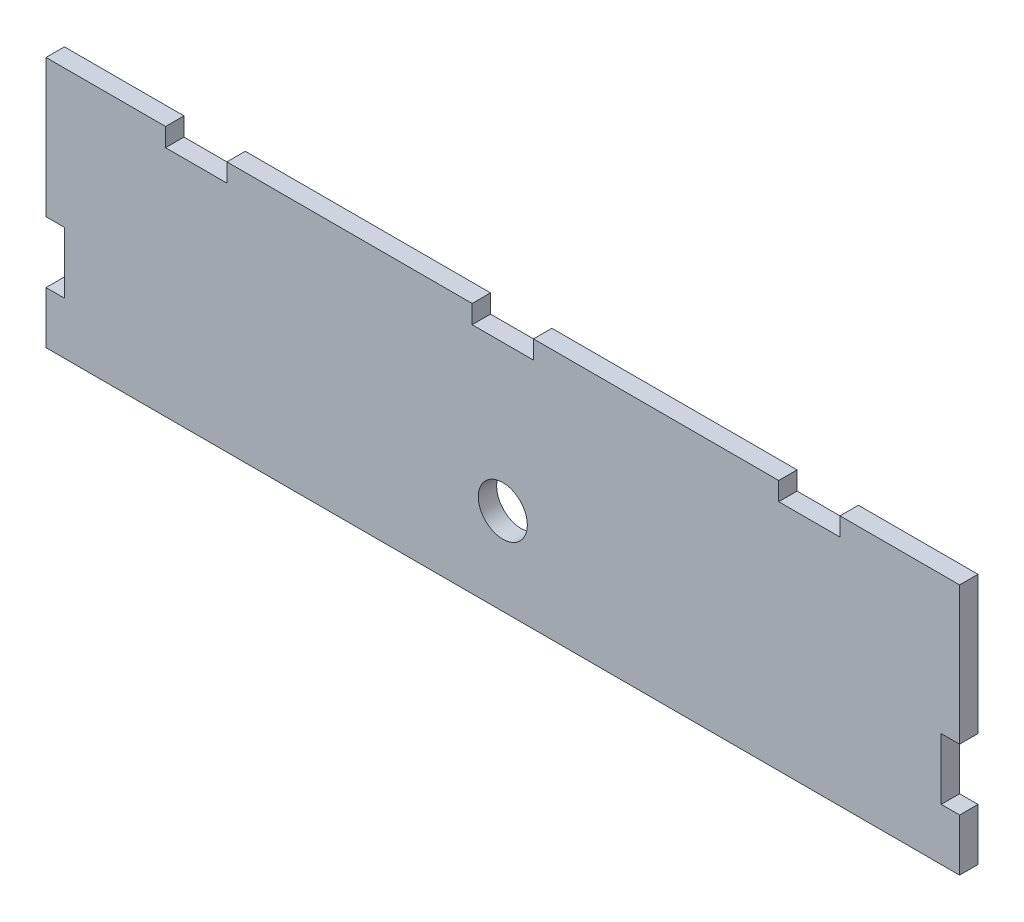
ISO-10303-21;
HEADER;
FILE_DESCRIPTION(('STEP AP214'),'2;1');
FILE_NAME('part.step','',(''),(''),'','','');
FILE_SCHEMA(('AUTOMOTIVE_DESIGN { 1 0 10303 214 1 1 1 1 }'));
ENDSEC;
DATA;
#1=APPLICATION_CONTEXT('core data for automotive mechanical design processes');
#2=APPLICATION_PROTOCOL_DEFINITION('international standard','automotive_design',2000,#1);
#3=PRODUCT_CONTEXT('',#1,'mechanical');
#4=PRODUCT('Part','Part','',(#3));
#5=PRODUCT_RELATED_PRODUCT_CATEGORY('part','',(#4));
#6=PRODUCT_DEFINITION_FORMATION('','',#4);
#7=PRODUCT_DEFINITION_CONTEXT('part definition',#1,'design');
#8=PRODUCT_DEFINITION('design','',#6,#7);
#9=PRODUCT_DEFINITION_SHAPE('','',#8);
#10=(LENGTH_UNIT() NAMED_UNIT(*) SI_UNIT(.MILLI.,.METRE.));
#11=(NAMED_UNIT(*) PLANE_ANGLE_UNIT() SI_UNIT($,.RADIAN.));
#12=(NAMED_UNIT(*) SI_UNIT($,.STERADIAN.) SOLID_ANGLE_UNIT());
#13=UNCERTAINTY_MEASURE_WITH_UNIT(LENGTH_MEASURE(1.E-05),#10,'distance_accuracy_value','');
#14=(GEOMETRIC_REPRESENTATION_CONTEXT(3) GLOBAL_UNCERTAINTY_ASSIGNED_CONTEXT((#13)) GLOBAL_UNIT_ASSIGNED_CONTEXT((#10,
#11,#12)) REPRESENTATION_CONTEXT('',''));
#15=CARTESIAN_POINT('',(0.,0.,0.));
#16=DIRECTION('',(0.,0.,1.));
#17=DIRECTION('',(1.,0.,0.));
#18=AXIS2_PLACEMENT_3D('',#15,#16,#17);
#19=CARTESIAN_POINT('',(74.5,-18.5,3.));
#20=DIRECTION('',(-1.,0.,0.));
#21=DIRECTION('',(0.,-1.,0.));
#22=AXIS2_PLACEMENT_3D('',#19,#20,#21);
#23=PLANE('',#22);
#24=DIRECTION('',(0.,1.,0.));
#25=VECTOR('',#24,1.);
#26=CARTESIAN_POINT('',(74.5,-18.5,0.));
#27=LINE('',#26,#25);
#28=CARTESIAN_POINT('',(74.5,-27.,0.));
#29=VERTEX_POINT('',#28);
#30=CARTESIAN_POINT('',(74.5,-18.5,0.));
#31=VERTEX_POINT('',#30);
#32=EDGE_CURVE('E225',#29,#31,#27,.T.);
#33=ORIENTED_EDGE('',*,*,#32,.T.);
#34=DIRECTION('',(0.,0.,-1.));
#35=VECTOR('',#34,1.);
#36=CARTESIAN_POINT('',(74.5,-18.5,3.));
#37=LINE('',#36,#35);
#38=CARTESIAN_POINT('',(74.5,-18.5,3.));
#39=VERTEX_POINT('',#38);
#40=EDGE_CURVE('E11',#39,#31,#37,.T.);
#41=ORIENTED_EDGE('',*,*,#40,.F.);
#42=DIRECTION('',(0.,1.,0.));
#43=VECTOR('',#42,1.);
#44=CARTESIAN_POINT('',(74.5,-18.5,3.));
#45=LINE('',#44,#43);
#46=CARTESIAN_POINT('',(74.5,-27.,3.));
#47=VERTEX_POINT('',#46);
#48=EDGE_CURVE('E272',#47,#39,#45,.T.);
#49=ORIENTED_EDGE('',*,*,#48,.F.);
#50=DIRECTION('',(0.,0.,-1.));
#51=VECTOR('',#50,1.);
#52=CARTESIAN_POINT('',(74.5,-27.,3.));
#53=LINE('',#52,#51);
#54=EDGE_CURVE('E221',#47,#29,#53,.T.);
#55=ORIENTED_EDGE('',*,*,#54,.T.);
#56=EDGE_LOOP('',(#33,#41,#49,#55));
#57=FACE_BOUND('',#56,.T.);
#58=ADVANCED_FACE('F33',(#57),#23,.F.);
#59=CARTESIAN_POINT('',(71.5,-18.5,3.));
#60=DIRECTION('',(0.,-1.,0.));
#61=DIRECTION('',(0.,0.,-1.));
#62=AXIS2_PLACEMENT_3D('',#59,#60,#61);
#63=PLANE('',#62);
#64=DIRECTION('',(-1.,0.,0.));
#65=VECTOR('',#64,1.);
#66=CARTESIAN_POINT('',(71.5,-18.5,0.));
#67=LINE('',#66,#65);
#68=CARTESIAN_POINT('',(71.5,-18.5,0.));
#69=VERTEX_POINT('',#68);
#70=EDGE_CURVE('E228',#31,#69,#67,.T.);
#71=ORIENTED_EDGE('',*,*,#70,.T.);
#72=DIRECTION('',(0.,0.,-1.));
#73=VECTOR('',#72,1.);
#74=CARTESIAN_POINT('',(71.5,-18.5,3.));
#75=LINE('',#74,#73);
#76=CARTESIAN_POINT('',(71.5,-18.5,3.));
#77=VERTEX_POINT('',#76);
#78=EDGE_CURVE('E41',#77,#69,#75,.T.);
#79=ORIENTED_EDGE('',*,*,#78,.F.);
#80=DIRECTION('',(-1.,0.,0.));
#81=VECTOR('',#80,1.);
#82=CARTESIAN_POINT('',(71.5,-18.5,3.));
#83=LINE('',#82,#81);
#84=EDGE_CURVE('E140',#39,#77,#83,.T.);
#85=ORIENTED_EDGE('',*,*,#84,.F.);
#86=ORIENTED_EDGE('',*,*,#40,.T.);
#87=EDGE_LOOP('',(#71,#79,#85,#86));
#88=FACE_BOUND('',#87,.T.);
#89=ADVANCED_FACE('F412',(#88),#63,.F.);
#90=CARTESIAN_POINT('',(71.5,-8.50000000000001,3.));
#91=DIRECTION('',(-1.,0.,0.));
#92=DIRECTION('',(0.,0.,1.));
#93=AXIS2_PLACEMENT_3D('',#90,#91,#92);
#94=PLANE('',#93);
#95=DIRECTION('',(0.,1.,0.));
#96=VECTOR('',#95,1.);
#97=CARTESIAN_POINT('',(71.5,-8.50000000000001,0.));
#98=LINE('',#97,#96);
#99=CARTESIAN_POINT('',(71.5,-8.50000000000001,0.));
#100=VERTEX_POINT('',#99);
#101=EDGE_CURVE('E231',#69,#100,#98,.T.);
#102=ORIENTED_EDGE('',*,*,#101,.T.);
#103=DIRECTION('',(0.,0.,-1.));
#104=VECTOR('',#103,1.);
#105=CARTESIAN_POINT('',(71.5,-8.50000000000001,3.));
#106=LINE('',#105,#104);
#107=CARTESIAN_POINT('',(71.5,-8.50000000000001,3.));
#108=VERTEX_POINT('',#107);
#109=EDGE_CURVE('E327',#108,#100,#106,.T.);
#110=ORIENTED_EDGE('',*,*,#109,.F.);
#111=DIRECTION('',(0.,1.,0.));
#112=VECTOR('',#111,1.);
#113=CARTESIAN_POINT('',(71.5,-8.50000000000001,3.));
#114=LINE('',#113,#112);
#115=EDGE_CURVE('E335',#77,#108,#114,.T.);
#116=ORIENTED_EDGE('',*,*,#115,.F.);
#117=ORIENTED_EDGE('',*,*,#78,.T.);
#118=EDGE_LOOP('',(#102,#110,#116,#117));
#119=FACE_BOUND('',#118,.T.);
#120=ADVANCED_FACE('F333',(#119),#94,.F.);
#121=CARTESIAN_POINT('',(71.5,-8.50000000000001,3.));
#122=DIRECTION('',(0.,1.,0.));
#123=DIRECTION('',(0.,0.,1.));
#124=AXIS2_PLACEMENT_3D('',#121,#122,#123);
#125=PLANE('',#124);
#126=DIRECTION('',(1.,0.,0.));
#127=VECTOR('',#126,1.);
#128=CARTESIAN_POINT('',(71.5,-8.50000000000001,0.));
#129=LINE('',#128,#127);
#130=CARTESIAN_POINT('',(74.5,-8.50000000000001,0.));
#131=VERTEX_POINT('',#130);
#132=EDGE_CURVE('E233',#100,#131,#129,.T.);
#133=ORIENTED_EDGE('',*,*,#132,.T.);
#134=DIRECTION('',(0.,0.,-1.));
#135=VECTOR('',#134,1.);
#136=CARTESIAN_POINT('',(74.5,-8.50000000000001,3.));
#137=LINE('',#136,#135);
#138=CARTESIAN_POINT('',(74.5,-8.50000000000001,3.));
#139=VERTEX_POINT('',#138);
#140=EDGE_CURVE('E324',#139,#131,#137,.T.);
#141=ORIENTED_EDGE('',*,*,#140,.F.);
#142=DIRECTION('',(1.,0.,0.));
#143=VECTOR('',#142,1.);
#144=CARTESIAN_POINT('',(71.5,-8.50000000000001,3.));
#145=LINE('',#144,#143);
#146=EDGE_CURVE('E353',#108,#139,#145,.T.);
#147=ORIENTED_EDGE('',*,*,#146,.F.);
#148=ORIENTED_EDGE('',*,*,#109,.T.);
#149=EDGE_LOOP('',(#133,#141,#147,#148));
#150=FACE_BOUND('',#149,.T.);
#151=ADVANCED_FACE('F344',(#150),#125,.F.);
#152=CARTESIAN_POINT('',(74.5,14.,3.));
#153=DIRECTION('',(-1.,0.,0.));
#154=DIRECTION('',(0.,0.,1.));
#155=AXIS2_PLACEMENT_3D('',#152,#153,#154);
#156=PLANE('',#155);
#157=DIRECTION('',(0.,1.,0.));
#158=VECTOR('',#157,1.);
#159=CARTESIAN_POINT('',(74.5,14.,0.));
#160=LINE('',#159,#158);
#161=CARTESIAN_POINT('',(74.5,14.,0.));
#162=VERTEX_POINT('',#161);
#163=EDGE_CURVE('E235',#131,#162,#160,.T.);
#164=ORIENTED_EDGE('',*,*,#163,.T.);
#165=DIRECTION('',(0.,0.,-1.));
#166=VECTOR('',#165,1.);
#167=CARTESIAN_POINT('',(74.5,14.,3.));
#168=LINE('',#167,#166);
#169=CARTESIAN_POINT('',(74.5,14.,3.));
#170=VERTEX_POINT('',#169);
#171=EDGE_CURVE('E321',#170,#162,#168,.T.);
#172=ORIENTED_EDGE('',*,*,#171,.F.);
#173=DIRECTION('',(0.,1.,0.));
#174=VECTOR('',#173,1.);
#175=CARTESIAN_POINT('',(74.5,14.,3.));
#176=LINE('',#175,#174);
#177=EDGE_CURVE('E350',#139,#170,#176,.T.);
#178=ORIENTED_EDGE('',*,*,#177,.F.);
#179=ORIENTED_EDGE('',*,*,#140,.T.);
#180=EDGE_LOOP('',(#164,#172,#178,#179));
#181=FACE_BOUND('',#180,.T.);
#182=ADVANCED_FACE('F348',(#181),#156,.F.);
#183=CARTESIAN_POINT('',(74.5,14.,3.));
#184=DIRECTION('',(0.,-1.,0.));
#185=DIRECTION('',(0.,0.,-1.));
#186=AXIS2_PLACEMENT_3D('',#183,#184,#185);
#187=PLANE('',#186);
#188=DIRECTION('',(-1.,0.,0.));
#189=VECTOR('',#188,1.);
#190=CARTESIAN_POINT('',(74.5,14.,0.));
#191=LINE('',#190,#189);
#192=CARTESIAN_POINT('',(55.,14.,0.));
#193=VERTEX_POINT('',#192);
#194=EDGE_CURVE('E237',#162,#193,#191,.T.);
#195=ORIENTED_EDGE('',*,*,#194,.T.);
#196=DIRECTION('',(0.,0.,-1.));
#197=VECTOR('',#196,1.);
#198=CARTESIAN_POINT('',(55.,14.,3.));
#199=LINE('',#198,#197);
#200=CARTESIAN_POINT('',(55.,14.,3.));
#201=VERTEX_POINT('',#200);
#202=EDGE_CURVE('E318',#201,#193,#199,.T.);
#203=ORIENTED_EDGE('',*,*,#202,.F.);
#204=DIRECTION('',(-1.,0.,0.));
#205=VECTOR('',#204,1.);
#206=CARTESIAN_POINT('',(74.5,14.,3.));
#207=LINE('',#206,#205);
#208=EDGE_CURVE('E352',#170,#201,#207,.T.);
#209=ORIENTED_EDGE('',*,*,#208,.F.);
#210=ORIENTED_EDGE('',*,*,#171,.T.);
#211=EDGE_LOOP('',(#195,#203,#209,#210));
#212=FACE_BOUND('',#211,.T.);
#213=ADVANCED_FACE('F425',(#212),#187,.F.);
#214=CARTESIAN_POINT('',(55.,14.,3.));
#215=DIRECTION('',(1.,0.,0.));
#216=DIRECTION('',(0.,0.,-1.));
#217=AXIS2_PLACEMENT_3D('',#214,#215,#216);
#218=PLANE('',#217);
#219=DIRECTION('',(0.,-1.,0.));
#220=VECTOR('',#219,1.);
#221=CARTESIAN_POINT('',(55.,14.,0.));
#222=LINE('',#221,#220);
#223=CARTESIAN_POINT('',(55.,11.,0.));
#224=VERTEX_POINT('',#223);
#225=EDGE_CURVE('E239',#193,#224,#222,.T.);
#226=ORIENTED_EDGE('',*,*,#225,.T.);
#227=DIRECTION('',(0.,0.,-1.));
#228=VECTOR('',#227,1.);
#229=CARTESIAN_POINT('',(55.,11.,3.));
#230=LINE('',#229,#228);
#231=CARTESIAN_POINT('',(55.,11.,3.));
#232=VERTEX_POINT('',#231);
#233=EDGE_CURVE('E315',#232,#224,#230,.T.);
#234=ORIENTED_EDGE('',*,*,#233,.F.);
#235=DIRECTION('',(0.,-1.,0.));
#236=VECTOR('',#235,1.);
#237=CARTESIAN_POINT('',(55.,14.,3.));
#238=LINE('',#237,#236);
#239=EDGE_CURVE('E355',#201,#232,#238,.T.);
#240=ORIENTED_EDGE('',*,*,#239,.F.);
#241=ORIENTED_EDGE('',*,*,#202,.T.);
#242=EDGE_LOOP('',(#226,#234,#240,#241));
#243=FACE_BOUND('',#242,.T.);
#244=ADVANCED_FACE('F428',(#243),#218,.F.);
#245=CARTESIAN_POINT('',(45.,11.,3.));
#246=DIRECTION('',(0.,-1.,0.));
#247=DIRECTION('',(0.,0.,-1.));
#248=AXIS2_PLACEMENT_3D('',#245,#246,#247);
#249=PLANE('',#248);
#250=DIRECTION('',(-1.,0.,0.));
#251=VECTOR('',#250,1.);
#252=CARTESIAN_POINT('',(45.,11.,0.));
#253=LINE('',#252,#251);
#254=CARTESIAN_POINT('',(45.,11.,0.));
#255=VERTEX_POINT('',#254);
#256=EDGE_CURVE('E241',#224,#255,#253,.T.);
#257=ORIENTED_EDGE('',*,*,#256,.T.);
#258=DIRECTION('',(0.,0.,-1.));
#259=VECTOR('',#258,1.);
#260=CARTESIAN_POINT('',(45.,11.,3.));
#261=LINE('',#260,#259);
#262=CARTESIAN_POINT('',(45.,11.,3.));
#263=VERTEX_POINT('',#262);
#264=EDGE_CURVE('E312',#263,#255,#261,.T.);
#265=ORIENTED_EDGE('',*,*,#264,.F.);
#266=DIRECTION('',(-1.,0.,0.));
#267=VECTOR('',#266,1.);
#268=CARTESIAN_POINT('',(45.,11.,3.));
#269=LINE('',#268,#267);
#270=EDGE_CURVE('E361',#232,#263,#269,.T.);
#271=ORIENTED_EDGE('',*,*,#270,.F.);
#272=ORIENTED_EDGE('',*,*,#233,.T.);
#273=EDGE_LOOP('',(#257,#265,#271,#272));
#274=FACE_BOUND('',#273,.T.);
#275=ADVANCED_FACE('F432',(#274),#249,.F.);
#276=CARTESIAN_POINT('',(45.,14.,3.));
#277=DIRECTION('',(-1.,0.,0.));
#278=DIRECTION('',(0.,0.,1.));
#279=AXIS2_PLACEMENT_3D('',#276,#277,#278);
#280=PLANE('',#279);
#281=DIRECTION('',(0.,1.,0.));
#282=VECTOR('',#281,1.);
#283=CARTESIAN_POINT('',(45.,14.,0.));
#284=LINE('',#283,#282);
#285=CARTESIAN_POINT('',(45.,14.,0.));
#286=VERTEX_POINT('',#285);
#287=EDGE_CURVE('E243',#255,#286,#284,.T.);
#288=ORIENTED_EDGE('',*,*,#287,.T.);
#289=DIRECTION('',(0.,0.,-1.));
#290=VECTOR('',#289,1.);
#291=CARTESIAN_POINT('',(45.,14.,3.));
#292=LINE('',#291,#290);
#293=CARTESIAN_POINT('',(45.,14.,3.));
#294=VERTEX_POINT('',#293);
#295=EDGE_CURVE('E309',#294,#286,#292,.T.);
#296=ORIENTED_EDGE('',*,*,#295,.F.);
#297=DIRECTION('',(0.,1.,0.));
#298=VECTOR('',#297,1.);
#299=CARTESIAN_POINT('',(45.,14.,3.));
#300=LINE('',#299,#298);
#301=EDGE_CURVE('E363',#263,#294,#300,.T.);
#302=ORIENTED_EDGE('',*,*,#301,.F.);
#303=ORIENTED_EDGE('',*,*,#264,.T.);
#304=EDGE_LOOP('',(#288,#296,#302,#303));
#305=FACE_BOUND('',#304,.T.);
#306=ADVANCED_FACE('F436',(#305),#280,.F.);
#307=CARTESIAN_POINT('',(45.,14.,3.));
#308=DIRECTION('',(0.,-1.,0.));
#309=DIRECTION('',(1.,0.,0.));
#310=AXIS2_PLACEMENT_3D('',#307,#308,#309);
#311=PLANE('',#310);
#312=DIRECTION('',(-1.,0.,0.));
#313=VECTOR('',#312,1.);
#314=CARTESIAN_POINT('',(45.,14.,0.));
#315=LINE('',#314,#313);
#316=CARTESIAN_POINT('',(5.,14.,0.));
#317=VERTEX_POINT('',#316);
#318=EDGE_CURVE('E245',#286,#317,#315,.T.);
#319=ORIENTED_EDGE('',*,*,#318,.T.);
#320=DIRECTION('',(0.,0.,-1.));
#321=VECTOR('',#320,1.);
#322=CARTESIAN_POINT('',(5.,14.,3.));
#323=LINE('',#322,#321);
#324=CARTESIAN_POINT('',(5.,14.,3.));
#325=VERTEX_POINT('',#324);
#326=EDGE_CURVE('E306',#325,#317,#323,.T.);
#327=ORIENTED_EDGE('',*,*,#326,.F.);
#328=DIRECTION('',(-1.,0.,0.));
#329=VECTOR('',#328,1.);
#330=CARTESIAN_POINT('',(45.,14.,3.));
#331=LINE('',#330,#329);
#332=EDGE_CURVE('E365',#294,#325,#331,.T.);
#333=ORIENTED_EDGE('',*,*,#332,.F.);
#334=ORIENTED_EDGE('',*,*,#295,.T.);
#335=EDGE_LOOP('',(#319,#327,#333,#334));
#336=FACE_BOUND('',#335,.T.);
#337=ADVANCED_FACE('F440',(#336),#311,.F.);
#338=CARTESIAN_POINT('',(5.,14.,3.));
#339=DIRECTION('',(1.,0.,0.));
#340=DIRECTION('',(0.,0.,-1.));
#341=AXIS2_PLACEMENT_3D('',#338,#339,#340);
#342=PLANE('',#341);
#343=DIRECTION('',(0.,-1.,0.));
#344=VECTOR('',#343,1.);
#345=CARTESIAN_POINT('',(5.,14.,0.));
#346=LINE('',#345,#344);
#347=CARTESIAN_POINT('',(5.,11.,0.));
#348=VERTEX_POINT('',#347);
#349=EDGE_CURVE('E247',#317,#348,#346,.T.);
#350=ORIENTED_EDGE('',*,*,#349,.T.);
#351=DIRECTION('',(0.,0.,-1.));
#352=VECTOR('',#351,1.);
#353=CARTESIAN_POINT('',(5.,11.,3.));
#354=LINE('',#353,#352);
#355=CARTESIAN_POINT('',(5.,11.,3.));
#356=VERTEX_POINT('',#355);
#357=EDGE_CURVE('E303',#356,#348,#354,.T.);
#358=ORIENTED_EDGE('',*,*,#357,.F.);
#359=DIRECTION('',(0.,-1.,0.));
#360=VECTOR('',#359,1.);
#361=CARTESIAN_POINT('',(5.,14.,3.));
#362=LINE('',#361,#360);
#363=EDGE_CURVE('E367',#325,#356,#362,.T.);
#364=ORIENTED_EDGE('',*,*,#363,.F.);
#365=ORIENTED_EDGE('',*,*,#326,.T.);
#366=EDGE_LOOP('',(#350,#358,#364,#365));
#367=FACE_BOUND('',#366,.T.);
#368=ADVANCED_FACE('F444',(#367),#342,.F.);
#369=CARTESIAN_POINT('',(-5.,11.,3.));
#370=DIRECTION('',(0.,-1.,0.));
#371=DIRECTION('',(0.,0.,-1.));
#372=AXIS2_PLACEMENT_3D('',#369,#370,#371);
#373=PLANE('',#372);
#374=DIRECTION('',(-1.,0.,0.));
#375=VECTOR('',#374,1.);
#376=CARTESIAN_POINT('',(-5.,11.,0.));
#377=LINE('',#376,#375);
#378=CARTESIAN_POINT('',(-5.,11.,0.));
#379=VERTEX_POINT('',#378);
#380=EDGE_CURVE('E249',#348,#379,#377,.T.);
#381=ORIENTED_EDGE('',*,*,#380,.T.);
#382=DIRECTION('',(0.,0.,-1.));
#383=VECTOR('',#382,1.);
#384=CARTESIAN_POINT('',(-5.,11.,3.));
#385=LINE('',#384,#383);
#386=CARTESIAN_POINT('',(-5.,11.,3.));
#387=VERTEX_POINT('',#386);
#388=EDGE_CURVE('E300',#387,#379,#385,.T.);
#389=ORIENTED_EDGE('',*,*,#388,.F.);
#390=DIRECTION('',(-1.,0.,0.));
#391=VECTOR('',#390,1.);
#392=CARTESIAN_POINT('',(-5.,11.,3.));
#393=LINE('',#392,#391);
#394=EDGE_CURVE('E369',#356,#387,#393,.T.);
#395=ORIENTED_EDGE('',*,*,#394,.F.);
#396=ORIENTED_EDGE('',*,*,#357,.T.);
#397=EDGE_LOOP('',(#381,#389,#395,#396));
#398=FACE_BOUND('',#397,.T.);
#399=ADVANCED_FACE('F448',(#398),#373,.F.);
#400=CARTESIAN_POINT('',(-5.,14.,3.));
#401=DIRECTION('',(-1.,0.,0.));
#402=DIRECTION('',(0.,0.,1.));
#403=AXIS2_PLACEMENT_3D('',#400,#401,#402);
#404=PLANE('',#403);
#405=DIRECTION('',(0.,1.,0.));
#406=VECTOR('',#405,1.);
#407=CARTESIAN_POINT('',(-5.,14.,0.));
#408=LINE('',#407,#406);
#409=CARTESIAN_POINT('',(-5.,14.,0.));
#410=VERTEX_POINT('',#409);
#411=EDGE_CURVE('E251',#379,#410,#408,.T.);
#412=ORIENTED_EDGE('',*,*,#411,.T.);
#413=DIRECTION('',(0.,0.,-1.));
#414=VECTOR('',#413,1.);
#415=CARTESIAN_POINT('',(-5.,14.,3.));
#416=LINE('',#415,#414);
#417=CARTESIAN_POINT('',(-5.,14.,3.));
#418=VERTEX_POINT('',#417);
#419=EDGE_CURVE('E297',#418,#410,#416,.T.);
#420=ORIENTED_EDGE('',*,*,#419,.F.);
#421=DIRECTION('',(0.,1.,0.));
#422=VECTOR('',#421,1.);
#423=CARTESIAN_POINT('',(-5.,14.,3.));
#424=LINE('',#423,#422);
#425=EDGE_CURVE('E371',#387,#418,#424,.T.);
#426=ORIENTED_EDGE('',*,*,#425,.F.);
#427=ORIENTED_EDGE('',*,*,#388,.T.);
#428=EDGE_LOOP('',(#412,#420,#426,#427));
#429=FACE_BOUND('',#428,.T.);
#430=ADVANCED_FACE('F452',(#429),#404,.F.);
#431=CARTESIAN_POINT('',(-5.,14.,3.));
#432=DIRECTION('',(0.,-1.,0.));
#433=DIRECTION('',(1.,0.,0.));
#434=AXIS2_PLACEMENT_3D('',#431,#432,#433);
#435=PLANE('',#434);
#436=DIRECTION('',(-1.,0.,0.));
#437=VECTOR('',#436,1.);
#438=CARTESIAN_POINT('',(-5.,14.,0.));
#439=LINE('',#438,#437);
#440=CARTESIAN_POINT('',(-45.,14.,0.));
#441=VERTEX_POINT('',#440);
#442=EDGE_CURVE('E253',#410,#441,#439,.T.);
#443=ORIENTED_EDGE('',*,*,#442,.T.);
#444=DIRECTION('',(0.,0.,-1.));
#445=VECTOR('',#444,1.);
#446=CARTESIAN_POINT('',(-45.,14.,3.));
#447=LINE('',#446,#445);
#448=CARTESIAN_POINT('',(-45.,14.,3.));
#449=VERTEX_POINT('',#448);
#450=EDGE_CURVE('E294',#449,#441,#447,.T.);
#451=ORIENTED_EDGE('',*,*,#450,.F.);
#452=DIRECTION('',(-1.,0.,0.));
#453=VECTOR('',#452,1.);
#454=CARTESIAN_POINT('',(-5.,14.,3.));
#455=LINE('',#454,#453);
#456=EDGE_CURVE('E373',#418,#449,#455,.T.);
#457=ORIENTED_EDGE('',*,*,#456,.F.);
#458=ORIENTED_EDGE('',*,*,#419,.T.);
#459=EDGE_LOOP('',(#443,#451,#457,#458));
#460=FACE_BOUND('',#459,.T.);
#461=ADVANCED_FACE('F456',(#460),#435,.F.);
#462=CARTESIAN_POINT('',(-45.,14.,3.));
#463=DIRECTION('',(1.,0.,0.));
#464=DIRECTION('',(0.,0.,-1.));
#465=AXIS2_PLACEMENT_3D('',#462,#463,#464);
#466=PLANE('',#465);
#467=DIRECTION('',(0.,-1.,0.));
#468=VECTOR('',#467,1.);
#469=CARTESIAN_POINT('',(-45.,14.,0.));
#470=LINE('',#469,#468);
#471=CARTESIAN_POINT('',(-45.,11.,0.));
#472=VERTEX_POINT('',#471);
#473=EDGE_CURVE('E255',#441,#472,#470,.T.);
#474=ORIENTED_EDGE('',*,*,#473,.T.);
#475=DIRECTION('',(0.,0.,-1.));
#476=VECTOR('',#475,1.);
#477=CARTESIAN_POINT('',(-45.,11.,3.));
#478=LINE('',#477,#476);
#479=CARTESIAN_POINT('',(-45.,11.,3.));
#480=VERTEX_POINT('',#479);
#481=EDGE_CURVE('E291',#480,#472,#478,.T.);
#482=ORIENTED_EDGE('',*,*,#481,.F.);
#483=DIRECTION('',(0.,-1.,0.));
#484=VECTOR('',#483,1.);
#485=CARTESIAN_POINT('',(-45.,14.,3.));
#486=LINE('',#485,#484);
#487=EDGE_CURVE('E375',#449,#480,#486,.T.);
#488=ORIENTED_EDGE('',*,*,#487,.F.);
#489=ORIENTED_EDGE('',*,*,#450,.T.);
#490=EDGE_LOOP('',(#474,#482,#488,#489));
#491=FACE_BOUND('',#490,.T.);
#492=ADVANCED_FACE('F460',(#491),#466,.F.);
#493=CARTESIAN_POINT('',(-45.,11.,3.));
#494=DIRECTION('',(0.,-1.,0.));
#495=DIRECTION('',(1.,0.,0.));
#496=AXIS2_PLACEMENT_3D('',#493,#494,#495);
#497=PLANE('',#496);
#498=DIRECTION('',(-1.,0.,0.));
#499=VECTOR('',#498,1.);
#500=CARTESIAN_POINT('',(-45.,11.,0.));
#501=LINE('',#500,#499);
#502=CARTESIAN_POINT('',(-55.,11.,0.));
#503=VERTEX_POINT('',#502);
#504=EDGE_CURVE('E257',#472,#503,#501,.T.);
#505=ORIENTED_EDGE('',*,*,#504,.T.);
#506=DIRECTION('',(0.,0.,-1.));
#507=VECTOR('',#506,1.);
#508=CARTESIAN_POINT('',(-55.,11.,3.));
#509=LINE('',#508,#507);
#510=CARTESIAN_POINT('',(-55.,11.,3.));
#511=VERTEX_POINT('',#510);
#512=EDGE_CURVE('E288',#511,#503,#509,.T.);
#513=ORIENTED_EDGE('',*,*,#512,.F.);
#514=DIRECTION('',(-1.,0.,0.));
#515=VECTOR('',#514,1.);
#516=CARTESIAN_POINT('',(-45.,11.,3.));
#517=LINE('',#516,#515);
#518=EDGE_CURVE('E377',#480,#511,#517,.T.);
#519=ORIENTED_EDGE('',*,*,#518,.F.);
#520=ORIENTED_EDGE('',*,*,#481,.T.);
#521=EDGE_LOOP('',(#505,#513,#519,#520));
#522=FACE_BOUND('',#521,.T.);
#523=ADVANCED_FACE('F464',(#522),#497,.F.);
#524=CARTESIAN_POINT('',(-55.,14.,3.));
#525=DIRECTION('',(-1.,0.,0.));
#526=DIRECTION('',(0.,0.,1.));
#527=AXIS2_PLACEMENT_3D('',#524,#525,#526);
#528=PLANE('',#527);
#529=DIRECTION('',(0.,1.,0.));
#530=VECTOR('',#529,1.);
#531=CARTESIAN_POINT('',(-55.,14.,0.));
#532=LINE('',#531,#530);
#533=CARTESIAN_POINT('',(-55.,14.,0.));
#534=VERTEX_POINT('',#533);
#535=EDGE_CURVE('E259',#503,#534,#532,.T.);
#536=ORIENTED_EDGE('',*,*,#535,.T.);
#537=DIRECTION('',(0.,0.,-1.));
#538=VECTOR('',#537,1.);
#539=CARTESIAN_POINT('',(-55.,14.,3.));
#540=LINE('',#539,#538);
#541=CARTESIAN_POINT('',(-55.,14.,3.));
#542=VERTEX_POINT('',#541);
#543=EDGE_CURVE('E285',#542,#534,#540,.T.);
#544=ORIENTED_EDGE('',*,*,#543,.F.);
#545=DIRECTION('',(0.,1.,0.));
#546=VECTOR('',#545,1.);
#547=CARTESIAN_POINT('',(-55.,14.,3.));
#548=LINE('',#547,#546);
#549=EDGE_CURVE('E379',#511,#542,#548,.T.);
#550=ORIENTED_EDGE('',*,*,#549,.F.);
#551=ORIENTED_EDGE('',*,*,#512,.T.);
#552=EDGE_LOOP('',(#536,#544,#550,#551));
#553=FACE_BOUND('',#552,.T.);
#554=ADVANCED_FACE('F468',(#553),#528,.F.);
#555=CARTESIAN_POINT('',(-55.,14.,3.));
#556=DIRECTION('',(0.,-1.,0.));
#557=DIRECTION('',(0.,0.,-1.));
#558=AXIS2_PLACEMENT_3D('',#555,#556,#557);
#559=PLANE('',#558);
#560=DIRECTION('',(-1.,0.,0.));
#561=VECTOR('',#560,1.);
#562=CARTESIAN_POINT('',(-55.,14.,0.));
#563=LINE('',#562,#561);
#564=CARTESIAN_POINT('',(-74.5,14.,0.));
#565=VERTEX_POINT('',#564);
#566=EDGE_CURVE('E261',#534,#565,#563,.T.);
#567=ORIENTED_EDGE('',*,*,#566,.T.);
#568=DIRECTION('',(0.,0.,-1.));
#569=VECTOR('',#568,1.);
#570=CARTESIAN_POINT('',(-74.5,14.,3.));
#571=LINE('',#570,#569);
#572=CARTESIAN_POINT('',(-74.5,14.,3.));
#573=VERTEX_POINT('',#572);
#574=EDGE_CURVE('E282',#573,#565,#571,.T.);
#575=ORIENTED_EDGE('',*,*,#574,.F.);
#576=DIRECTION('',(-1.,0.,0.));
#577=VECTOR('',#576,1.);
#578=CARTESIAN_POINT('',(-55.,14.,3.));
#579=LINE('',#578,#577);
#580=EDGE_CURVE('E381',#542,#573,#579,.T.);
#581=ORIENTED_EDGE('',*,*,#580,.F.);
#582=ORIENTED_EDGE('',*,*,#543,.T.);
#583=EDGE_LOOP('',(#567,#575,#581,#582));
#584=FACE_BOUND('',#583,.T.);
#585=ADVANCED_FACE('F472',(#584),#559,.F.);
#586=CARTESIAN_POINT('',(-74.5,14.,3.));
#587=DIRECTION('',(1.,0.,0.));
#588=DIRECTION('',(0.,0.,-1.));
#589=AXIS2_PLACEMENT_3D('',#586,#587,#588);
#590=PLANE('',#589);
#591=DIRECTION('',(0.,-1.,0.));
#592=VECTOR('',#591,1.);
#593=CARTESIAN_POINT('',(-74.5,14.,0.));
#594=LINE('',#593,#592);
#595=CARTESIAN_POINT('',(-74.5,-8.50000000000001,0.));
#596=VERTEX_POINT('',#595);
#597=EDGE_CURVE('E263',#565,#596,#594,.T.);
#598=ORIENTED_EDGE('',*,*,#597,.T.);
#599=DIRECTION('',(0.,0.,-1.));
#600=VECTOR('',#599,1.);
#601=CARTESIAN_POINT('',(-74.5,-8.50000000000001,3.));
#602=LINE('',#601,#600);
#603=CARTESIAN_POINT('',(-74.5,-8.50000000000001,3.));
#604=VERTEX_POINT('',#603);
#605=EDGE_CURVE('E279',#604,#596,#602,.T.);
#606=ORIENTED_EDGE('',*,*,#605,.F.);
#607=DIRECTION('',(0.,-1.,0.));
#608=VECTOR('',#607,1.);
#609=CARTESIAN_POINT('',(-74.5,14.,3.));
#610=LINE('',#609,#608);
#611=EDGE_CURVE('E383',#573,#604,#610,.T.);
#612=ORIENTED_EDGE('',*,*,#611,.F.);
#613=ORIENTED_EDGE('',*,*,#574,.T.);
#614=EDGE_LOOP('',(#598,#606,#612,#613));
#615=FACE_BOUND('',#614,.T.);
#616=ADVANCED_FACE('F476',(#615),#590,.F.);
#617=CARTESIAN_POINT('',(-71.5,-8.50000000000001,3.));
#618=DIRECTION('',(0.,1.,0.));
#619=DIRECTION('',(0.,0.,1.));
#620=AXIS2_PLACEMENT_3D('',#617,#618,#619);
#621=PLANE('',#620);
#622=DIRECTION('',(1.,0.,0.));
#623=VECTOR('',#622,1.);
#624=CARTESIAN_POINT('',(-71.5,-8.50000000000001,0.));
#625=LINE('',#624,#623);
#626=CARTESIAN_POINT('',(-71.5,-8.50000000000001,0.));
#627=VERTEX_POINT('',#626);
#628=EDGE_CURVE('E265',#596,#627,#625,.T.);
#629=ORIENTED_EDGE('',*,*,#628,.T.);
#630=DIRECTION('',(0.,0.,-1.));
#631=VECTOR('',#630,1.);
#632=CARTESIAN_POINT('',(-71.5,-8.50000000000001,3.));
#633=LINE('',#632,#631);
#634=CARTESIAN_POINT('',(-71.5,-8.50000000000001,3.));
#635=VERTEX_POINT('',#634);
#636=EDGE_CURVE('E276',#635,#627,#633,.T.);
#637=ORIENTED_EDGE('',*,*,#636,.F.);
#638=DIRECTION('',(1.,0.,0.));
#639=VECTOR('',#638,1.);
#640=CARTESIAN_POINT('',(-71.5,-8.50000000000001,3.));
#641=LINE('',#640,#639);
#642=EDGE_CURVE('E385',#604,#635,#641,.T.);
#643=ORIENTED_EDGE('',*,*,#642,.F.);
#644=ORIENTED_EDGE('',*,*,#605,.T.);
#645=EDGE_LOOP('',(#629,#637,#643,#644));
#646=FACE_BOUND('',#645,.T.);
#647=ADVANCED_FACE('F391',(#646),#621,.F.);
#648=CARTESIAN_POINT('',(-71.5,-8.50000000000001,3.));
#649=DIRECTION('',(1.,0.,0.));
#650=DIRECTION('',(0.,0.,-1.));
#651=AXIS2_PLACEMENT_3D('',#648,#649,#650);
#652=PLANE('',#651);
#653=DIRECTION('',(0.,-1.,0.));
#654=VECTOR('',#653,1.);
#655=CARTESIAN_POINT('',(-71.5,-8.50000000000001,0.));
#656=LINE('',#655,#654);
#657=CARTESIAN_POINT('',(-71.5,-18.5,0.));
#658=VERTEX_POINT('',#657);
#659=EDGE_CURVE('E267',#627,#658,#656,.T.);
#660=ORIENTED_EDGE('',*,*,#659,.T.);
#661=DIRECTION('',(0.,0.,-1.));
#662=VECTOR('',#661,1.);
#663=CARTESIAN_POINT('',(-71.5,-18.5,3.));
#664=LINE('',#663,#662);
#665=CARTESIAN_POINT('',(-71.5,-18.5,3.));
#666=VERTEX_POINT('',#665);
#667=EDGE_CURVE('E216',#666,#658,#664,.T.);
#668=ORIENTED_EDGE('',*,*,#667,.F.);
#669=DIRECTION('',(0.,-1.,0.));
#670=VECTOR('',#669,1.);
#671=CARTESIAN_POINT('',(-71.5,-8.50000000000001,3.));
#672=LINE('',#671,#670);
#673=EDGE_CURVE('E207',#635,#666,#672,.T.);
#674=ORIENTED_EDGE('',*,*,#673,.F.);
#675=ORIENTED_EDGE('',*,*,#636,.T.);
#676=EDGE_LOOP('',(#660,#668,#674,#675));
#677=FACE_BOUND('',#676,.T.);
#678=ADVANCED_FACE('F395',(#677),#652,.F.);
#679=CARTESIAN_POINT('',(-71.5,-18.5,3.));
#680=DIRECTION('',(0.,-1.,0.));
#681=DIRECTION('',(0.,0.,-1.));
#682=AXIS2_PLACEMENT_3D('',#679,#680,#681);
#683=PLANE('',#682);
#684=DIRECTION('',(-1.,0.,0.));
#685=VECTOR('',#684,1.);
#686=CARTESIAN_POINT('',(-71.5,-18.5,0.));
#687=LINE('',#686,#685);
#688=CARTESIAN_POINT('',(-74.5,-18.5,0.));
#689=VERTEX_POINT('',#688);
#690=EDGE_CURVE('E215',#658,#689,#687,.T.);
#691=ORIENTED_EDGE('',*,*,#690,.T.);
#692=DIRECTION('',(0.,0.,-1.));
#693=VECTOR('',#692,1.);
#694=CARTESIAN_POINT('',(-74.5,-18.5,3.));
#695=LINE('',#694,#693);
#696=CARTESIAN_POINT('',(-74.5,-18.5,3.));
#697=VERTEX_POINT('',#696);
#698=EDGE_CURVE('E212',#697,#689,#695,.T.);
#699=ORIENTED_EDGE('',*,*,#698,.F.);
#700=DIRECTION('',(-1.,0.,0.));
#701=VECTOR('',#700,1.);
#702=CARTESIAN_POINT('',(-71.5,-18.5,3.));
#703=LINE('',#702,#701);
#704=EDGE_CURVE('E201',#666,#697,#703,.T.);
#705=ORIENTED_EDGE('',*,*,#704,.F.);
#706=ORIENTED_EDGE('',*,*,#667,.T.);
#707=EDGE_LOOP('',(#691,#699,#705,#706));
#708=FACE_BOUND('',#707,.T.);
#709=ADVANCED_FACE('F213',(#708),#683,.F.);
#710=CARTESIAN_POINT('',(-74.5,-18.5,3.));
#711=DIRECTION('',(1.,0.,0.));
#712=DIRECTION('',(0.,0.,-1.));
#713=AXIS2_PLACEMENT_3D('',#710,#711,#712);
#714=PLANE('',#713);
#715=DIRECTION('',(0.,-1.,0.));
#716=VECTOR('',#715,1.);
#717=CARTESIAN_POINT('',(-74.5,-18.5,0.));
#718=LINE('',#717,#716);
#719=CARTESIAN_POINT('',(-74.5,-27.,0.));
#720=VERTEX_POINT('',#719);
#721=EDGE_CURVE('E126',#689,#720,#718,.T.);
#722=ORIENTED_EDGE('',*,*,#721,.T.);
#723=DIRECTION('',(0.,0.,-1.));
#724=VECTOR('',#723,1.);
#725=CARTESIAN_POINT('',(-74.5,-27.,3.));
#726=LINE('',#725,#724);
#727=CARTESIAN_POINT('',(-74.5,-27.,3.));
#728=VERTEX_POINT('',#727);
#729=EDGE_CURVE('E217',#728,#720,#726,.T.);
#730=ORIENTED_EDGE('',*,*,#729,.F.);
#731=DIRECTION('',(0.,-1.,0.));
#732=VECTOR('',#731,1.);
#733=CARTESIAN_POINT('',(-74.5,-18.5,3.));
#734=LINE('',#733,#732);
#735=EDGE_CURVE('E205',#697,#728,#734,.T.);
#736=ORIENTED_EDGE('',*,*,#735,.F.);
#737=ORIENTED_EDGE('',*,*,#698,.T.);
#738=EDGE_LOOP('',(#722,#730,#736,#737));
#739=FACE_BOUND('',#738,.T.);
#740=ADVANCED_FACE('F219',(#739),#714,.F.);
#741=CARTESIAN_POINT('',(-74.5,-27.,3.));
#742=DIRECTION('',(0.,1.,0.));
#743=DIRECTION('',(0.,0.,1.));
#744=AXIS2_PLACEMENT_3D('',#741,#742,#743);
#745=PLANE('',#744);
#746=DIRECTION('',(1.,0.,0.));
#747=VECTOR('',#746,1.);
#748=CARTESIAN_POINT('',(-74.5,-27.,0.));
#749=LINE('',#748,#747);
#750=EDGE_CURVE('E132',#720,#29,#749,.T.);
#751=ORIENTED_EDGE('',*,*,#750,.T.);
#752=ORIENTED_EDGE('',*,*,#54,.F.);
#753=DIRECTION('',(1.,0.,0.));
#754=VECTOR('',#753,1.);
#755=CARTESIAN_POINT('',(-74.5,-27.,3.));
#756=LINE('',#755,#754);
#757=EDGE_CURVE('E49',#728,#47,#756,.T.);
#758=ORIENTED_EDGE('',*,*,#757,.F.);
#759=ORIENTED_EDGE('',*,*,#729,.T.);
#760=EDGE_LOOP('',(#751,#752,#758,#759));
#761=FACE_BOUND('',#760,.T.);
#762=ADVANCED_FACE('F399',(#761),#745,.F.);
#763=CARTESIAN_POINT('',(0.,0.,3.));
#764=DIRECTION('',(0.,0.,1.));
#765=DIRECTION('',(1.,0.,0.));
#766=AXIS2_PLACEMENT_3D('',#763,#764,#765);
#767=PLANE('',#766);
#768=CARTESIAN_POINT('',(0.,-12.79,3.));
#769=DIRECTION('',(0.,0.,1.));
#770=DIRECTION('',(1.,0.,0.));
#771=AXIS2_PLACEMENT_3D('',#768,#769,#770);
#772=CIRCLE('',#771,4.);
#773=CARTESIAN_POINT('',(4.,-12.79,3.));
#774=VERTEX_POINT('',#773);
#775=EDGE_CURVE('E229',#774,#774,#772,.T.);
#776=ORIENTED_EDGE('',*,*,#775,.F.);
#777=EDGE_LOOP('',(#776));
#778=FACE_BOUND('',#777,.T.);
#779=ORIENTED_EDGE('',*,*,#48,.T.);
#780=ORIENTED_EDGE('',*,*,#84,.T.);
#781=ORIENTED_EDGE('',*,*,#115,.T.);
#782=ORIENTED_EDGE('',*,*,#146,.T.);
#783=ORIENTED_EDGE('',*,*,#177,.T.);
#784=ORIENTED_EDGE('',*,*,#208,.T.);
#785=ORIENTED_EDGE('',*,*,#239,.T.);
#786=ORIENTED_EDGE('',*,*,#270,.T.);
#787=ORIENTED_EDGE('',*,*,#301,.T.);
#788=ORIENTED_EDGE('',*,*,#332,.T.);
#789=ORIENTED_EDGE('',*,*,#363,.T.);
#790=ORIENTED_EDGE('',*,*,#394,.T.);
#791=ORIENTED_EDGE('',*,*,#425,.T.);
#792=ORIENTED_EDGE('',*,*,#456,.T.);
#793=ORIENTED_EDGE('',*,*,#487,.T.);
#794=ORIENTED_EDGE('',*,*,#518,.T.);
#795=ORIENTED_EDGE('',*,*,#549,.T.);
#796=ORIENTED_EDGE('',*,*,#580,.T.);
#797=ORIENTED_EDGE('',*,*,#611,.T.);
#798=ORIENTED_EDGE('',*,*,#642,.T.);
#799=ORIENTED_EDGE('',*,*,#673,.T.);
#800=ORIENTED_EDGE('',*,*,#704,.T.);
#801=ORIENTED_EDGE('',*,*,#735,.T.);
#802=ORIENTED_EDGE('',*,*,#757,.T.);
#803=EDGE_LOOP('',(#779,#780,#781,#782,#783,#784,#785,#786,#787,#788,#789,#790,#791,#792,#793,
#794,#795,#796,#797,#798,#799,#800,#801,#802));
#804=FACE_BOUND('',#803,.T.);
#805=ADVANCED_FACE('F203',(#778,#804),#767,.T.);
#806=CARTESIAN_POINT('',(0.,0.,0.));
#807=DIRECTION('',(0.,0.,1.));
#808=DIRECTION('',(1.,0.,0.));
#809=AXIS2_PLACEMENT_3D('',#806,#807,#808);
#810=PLANE('',#809);
#811=CARTESIAN_POINT('',(0.,-12.79,0.));
#812=DIRECTION('',(0.,0.,1.));
#813=DIRECTION('',(1.,0.,0.));
#814=AXIS2_PLACEMENT_3D('',#811,#812,#813);
#815=CIRCLE('',#814,4.);
#816=CARTESIAN_POINT('',(4.,-12.79,0.));
#817=VERTEX_POINT('',#816);
#818=EDGE_CURVE('E530',#817,#817,#815,.T.);
#819=ORIENTED_EDGE('',*,*,#818,.T.);
#820=EDGE_LOOP('',(#819));
#821=FACE_BOUND('',#820,.T.);
#822=ORIENTED_EDGE('',*,*,#32,.F.);
#823=ORIENTED_EDGE('',*,*,#750,.F.);
#824=ORIENTED_EDGE('',*,*,#721,.F.);
#825=ORIENTED_EDGE('',*,*,#690,.F.);
#826=ORIENTED_EDGE('',*,*,#659,.F.);
#827=ORIENTED_EDGE('',*,*,#628,.F.);
#828=ORIENTED_EDGE('',*,*,#597,.F.);
#829=ORIENTED_EDGE('',*,*,#566,.F.);
#830=ORIENTED_EDGE('',*,*,#535,.F.);
#831=ORIENTED_EDGE('',*,*,#504,.F.);
#832=ORIENTED_EDGE('',*,*,#473,.F.);
#833=ORIENTED_EDGE('',*,*,#442,.F.);
#834=ORIENTED_EDGE('',*,*,#411,.F.);
#835=ORIENTED_EDGE('',*,*,#380,.F.);
#836=ORIENTED_EDGE('',*,*,#349,.F.);
#837=ORIENTED_EDGE('',*,*,#318,.F.);
#838=ORIENTED_EDGE('',*,*,#287,.F.);
#839=ORIENTED_EDGE('',*,*,#256,.F.);
#840=ORIENTED_EDGE('',*,*,#225,.F.);
#841=ORIENTED_EDGE('',*,*,#194,.F.);
#842=ORIENTED_EDGE('',*,*,#163,.F.);
#843=ORIENTED_EDGE('',*,*,#132,.F.);
#844=ORIENTED_EDGE('',*,*,#101,.F.);
#845=ORIENTED_EDGE('',*,*,#70,.F.);
#846=EDGE_LOOP('',(#822,#823,#824,#825,#826,#827,#828,#829,#830,#831,#832,#833,#834,#835,#836,
#837,#838,#839,#840,#841,#842,#843,#844,#845));
#847=FACE_BOUND('',#846,.T.);
#848=ADVANCED_FACE('F339',(#821,#847),#810,.F.);
#849=CARTESIAN_POINT('',(0.,-12.79,3.));
#850=DIRECTION('',(0.,0.,-1.));
#851=DIRECTION('',(-1.,0.,0.));
#852=AXIS2_PLACEMENT_3D('',#849,#850,#851);
#853=CYLINDRICAL_SURFACE('',#852,4.);
#854=ORIENTED_EDGE('',*,*,#775,.T.);
#855=EDGE_LOOP('',(#854));
#856=FACE_BOUND('',#855,.T.);
#857=ORIENTED_EDGE('',*,*,#818,.F.);
#858=EDGE_LOOP('',(#857));
#859=FACE_BOUND('',#858,.T.);
#860=ADVANCED_FACE('F509',(#856,#859),#853,.F.);
#861=CLOSED_SHELL('',(#58,#89,#120,#151,#182,#213,#244,#275,#306,#337,#368,#399,#430,#461,#492,
#523,#554,#585,#616,#647,#678,#709,#740,#762,#805,#848,#860));
#862=MANIFOLD_SOLID_BREP('B2',#861);
#863=ADVANCED_BREP_SHAPE_REPRESENTATION('',(#18,#862),#14);
#864=SHAPE_DEFINITION_REPRESENTATION(#9,#863);
ENDSEC;
END-ISO-10303-21;
